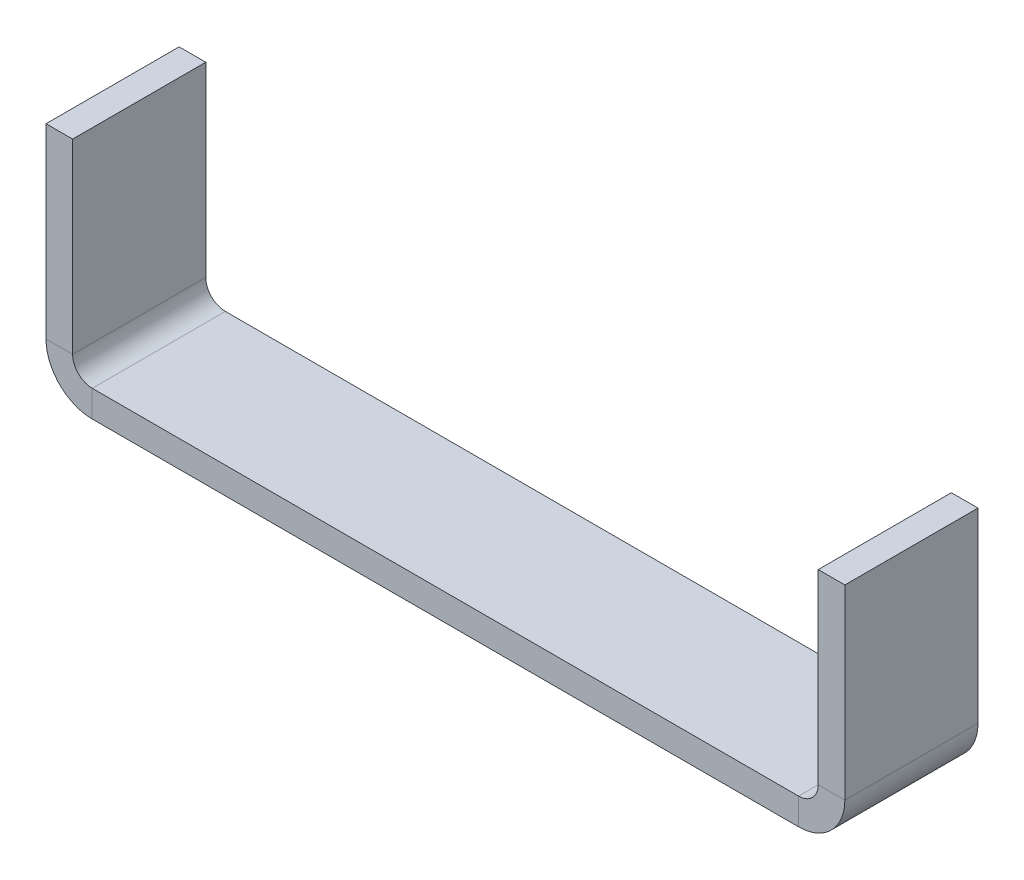
ISO-10303-21;
HEADER;
FILE_DESCRIPTION(('STEP AP214'),'2;1');
FILE_NAME('part.step','',(''),(''),'','','');
FILE_SCHEMA(('AUTOMOTIVE_DESIGN { 1 0 10303 214 1 1 1 1 }'));
ENDSEC;
DATA;
#1=APPLICATION_CONTEXT('core data for automotive mechanical design processes');
#2=APPLICATION_PROTOCOL_DEFINITION('international standard','automotive_design',2000,#1);
#3=PRODUCT_CONTEXT('',#1,'mechanical');
#4=PRODUCT('Part','Part','',(#3));
#5=PRODUCT_RELATED_PRODUCT_CATEGORY('part','',(#4));
#6=PRODUCT_DEFINITION_FORMATION('','',#4);
#7=PRODUCT_DEFINITION_CONTEXT('part definition',#1,'design');
#8=PRODUCT_DEFINITION('design','',#6,#7);
#9=PRODUCT_DEFINITION_SHAPE('','',#8);
#10=(LENGTH_UNIT() NAMED_UNIT(*) SI_UNIT(.MILLI.,.METRE.));
#11=(NAMED_UNIT(*) PLANE_ANGLE_UNIT() SI_UNIT($,.RADIAN.));
#12=(NAMED_UNIT(*) SI_UNIT($,.STERADIAN.) SOLID_ANGLE_UNIT());
#13=UNCERTAINTY_MEASURE_WITH_UNIT(LENGTH_MEASURE(1.E-05),#10,'distance_accuracy_value','');
#14=(GEOMETRIC_REPRESENTATION_CONTEXT(3) GLOBAL_UNCERTAINTY_ASSIGNED_CONTEXT((#13)) GLOBAL_UNIT_ASSIGNED_CONTEXT((#10,
#11,#12)) REPRESENTATION_CONTEXT('',''));
#15=CARTESIAN_POINT('',(0.,0.,0.));
#16=DIRECTION('',(0.,0.,1.));
#17=DIRECTION('',(1.,0.,0.));
#18=AXIS2_PLACEMENT_3D('',#15,#16,#17);
#19=CARTESIAN_POINT('',(0.,-1.,0.));
#20=DIRECTION('',(0.,1.,0.));
#21=DIRECTION('',(0.,0.,1.));
#22=AXIS2_PLACEMENT_3D('',#19,#20,#21);
#23=PLANE('',#22);
#24=DIRECTION('',(0.,0.,-1.));
#25=VECTOR('',#24,1.);
#26=CARTESIAN_POINT('',(13.2634,-1.,-2.5));
#27=LINE('',#26,#25);
#28=CARTESIAN_POINT('',(13.2634,-1.,-2.5));
#29=VERTEX_POINT('',#28);
#30=CARTESIAN_POINT('',(13.2634,-1.,2.5));
#31=VERTEX_POINT('',#30);
#32=EDGE_CURVE('E210',#29,#31,#27,.F.);
#33=ORIENTED_EDGE('',*,*,#32,.T.);
#34=DIRECTION('',(1.,0.,0.));
#35=VECTOR('',#34,1.);
#36=CARTESIAN_POINT('',(-15.,-1.,2.5));
#37=LINE('',#36,#35);
#38=CARTESIAN_POINT('',(-13.2634,-1.,2.5));
#39=VERTEX_POINT('',#38);
#40=EDGE_CURVE('E13',#39,#31,#37,.T.);
#41=ORIENTED_EDGE('',*,*,#40,.F.);
#42=DIRECTION('',(0.,0.,1.));
#43=VECTOR('',#42,1.);
#44=CARTESIAN_POINT('',(-13.2634,-1.,2.5));
#45=LINE('',#44,#43);
#46=CARTESIAN_POINT('',(-13.2634,-1.,-2.5));
#47=VERTEX_POINT('',#46);
#48=EDGE_CURVE('E263',#39,#47,#45,.F.);
#49=ORIENTED_EDGE('',*,*,#48,.T.);
#50=DIRECTION('',(-1.,0.,0.));
#51=VECTOR('',#50,1.);
#52=CARTESIAN_POINT('',(-15.,-1.,-2.5));
#53=LINE('',#52,#51);
#54=EDGE_CURVE('E86',#29,#47,#53,.T.);
#55=ORIENTED_EDGE('',*,*,#54,.F.);
#56=EDGE_LOOP('',(#33,#41,#49,#55));
#57=FACE_BOUND('',#56,.T.);
#58=ADVANCED_FACE('F77',(#57),#23,.F.);
#59=CARTESIAN_POINT('',(0.,0.,0.));
#60=DIRECTION('',(0.,1.,0.));
#61=DIRECTION('',(0.,0.,1.));
#62=AXIS2_PLACEMENT_3D('',#59,#60,#61);
#63=PLANE('',#62);
#64=DIRECTION('',(1.,0.,0.));
#65=VECTOR('',#64,1.);
#66=CARTESIAN_POINT('',(-15.,0.,2.5));
#67=LINE('',#66,#65);
#68=CARTESIAN_POINT('',(-13.2634,0.,2.5));
#69=VERTEX_POINT('',#68);
#70=CARTESIAN_POINT('',(13.2634,0.,2.5));
#71=VERTEX_POINT('',#70);
#72=EDGE_CURVE('E81',#69,#71,#67,.T.);
#73=ORIENTED_EDGE('',*,*,#72,.T.);
#74=DIRECTION('',(0.,0.,-1.));
#75=VECTOR('',#74,1.);
#76=CARTESIAN_POINT('',(13.2634,0.,-2.5));
#77=LINE('',#76,#75);
#78=CARTESIAN_POINT('',(13.2634,0.,-2.5));
#79=VERTEX_POINT('',#78);
#80=EDGE_CURVE('E222',#79,#71,#77,.F.);
#81=ORIENTED_EDGE('',*,*,#80,.F.);
#82=DIRECTION('',(-1.,0.,0.));
#83=VECTOR('',#82,1.);
#84=CARTESIAN_POINT('',(-15.,0.,-2.5));
#85=LINE('',#84,#83);
#86=CARTESIAN_POINT('',(-13.2634,0.,-2.5));
#87=VERTEX_POINT('',#86);
#88=EDGE_CURVE('E281',#79,#87,#85,.T.);
#89=ORIENTED_EDGE('',*,*,#88,.T.);
#90=DIRECTION('',(0.,0.,1.));
#91=VECTOR('',#90,1.);
#92=CARTESIAN_POINT('',(-13.2634,0.,2.5));
#93=LINE('',#92,#91);
#94=EDGE_CURVE('E94',#69,#87,#93,.F.);
#95=ORIENTED_EDGE('',*,*,#94,.F.);
#96=EDGE_LOOP('',(#73,#81,#89,#95));
#97=FACE_BOUND('',#96,.T.);
#98=ADVANCED_FACE('F285',(#97),#63,.T.);
#99=CARTESIAN_POINT('',(-15.,-1.,-2.5));
#100=DIRECTION('',(0.,0.,-1.));
#101=DIRECTION('',(-1.,0.,0.));
#102=AXIS2_PLACEMENT_3D('',#99,#100,#101);
#103=PLANE('',#102);
#104=ORIENTED_EDGE('',*,*,#88,.F.);
#105=DIRECTION('',(0.,-1.,0.));
#106=VECTOR('',#105,1.);
#107=CARTESIAN_POINT('',(13.2634,0.,-2.5));
#108=LINE('',#107,#106);
#109=EDGE_CURVE('E216',#79,#29,#108,.T.);
#110=ORIENTED_EDGE('',*,*,#109,.T.);
#111=ORIENTED_EDGE('',*,*,#54,.T.);
#112=DIRECTION('',(0.,-1.,0.));
#113=VECTOR('',#112,1.);
#114=CARTESIAN_POINT('',(-13.2634,0.,-2.5));
#115=LINE('',#114,#113);
#116=EDGE_CURVE('E278',#87,#47,#115,.T.);
#117=ORIENTED_EDGE('',*,*,#116,.F.);
#118=EDGE_LOOP('',(#104,#110,#111,#117));
#119=FACE_BOUND('',#118,.T.);
#120=ADVANCED_FACE('F79',(#119),#103,.T.);
#121=CARTESIAN_POINT('',(-15.,-1.,2.5));
#122=DIRECTION('',(0.,0.,1.));
#123=DIRECTION('',(1.,0.,0.));
#124=AXIS2_PLACEMENT_3D('',#121,#122,#123);
#125=PLANE('',#124);
#126=DIRECTION('',(0.,-1.,0.));
#127=VECTOR('',#126,1.);
#128=CARTESIAN_POINT('',(13.2634,0.,2.5));
#129=LINE('',#128,#127);
#130=EDGE_CURVE('E228',#71,#31,#129,.T.);
#131=ORIENTED_EDGE('',*,*,#130,.F.);
#132=ORIENTED_EDGE('',*,*,#72,.F.);
#133=DIRECTION('',(0.,-1.,0.));
#134=VECTOR('',#133,1.);
#135=CARTESIAN_POINT('',(-13.2634,0.,2.5));
#136=LINE('',#135,#134);
#137=EDGE_CURVE('E269',#69,#39,#136,.T.);
#138=ORIENTED_EDGE('',*,*,#137,.T.);
#139=ORIENTED_EDGE('',*,*,#40,.T.);
#140=EDGE_LOOP('',(#131,#132,#138,#139));
#141=FACE_BOUND('',#140,.T.);
#142=ADVANCED_FACE('F357',(#141),#125,.T.);
#143=CARTESIAN_POINT('',(-13.2634,0.7366,-2.5));
#144=DIRECTION('',(0.,0.,-1.));
#145=DIRECTION('',(-1.,0.,0.));
#146=AXIS2_PLACEMENT_3D('',#143,#144,#145);
#147=PLANE('',#146);
#148=DIRECTION('',(1.,0.,0.));
#149=VECTOR('',#148,1.);
#150=CARTESIAN_POINT('',(-15.,0.736599999999993,-2.5));
#151=LINE('',#150,#149);
#152=CARTESIAN_POINT('',(-14.,0.736599999999997,-2.5));
#153=VERTEX_POINT('',#152);
#154=CARTESIAN_POINT('',(-15.,0.736599999999993,-2.5));
#155=VERTEX_POINT('',#154);
#156=EDGE_CURVE('E231',#153,#155,#151,.F.);
#157=ORIENTED_EDGE('',*,*,#156,.F.);
#158=CARTESIAN_POINT('',(-13.2634,0.7366,-2.5));
#159=DIRECTION('',(0.,0.,1.));
#160=DIRECTION('',(1.,0.,0.));
#161=AXIS2_PLACEMENT_3D('',#158,#159,#160);
#162=CIRCLE('',#161,0.7366);
#163=EDGE_CURVE('E272',#87,#153,#162,.F.);
#164=ORIENTED_EDGE('',*,*,#163,.F.);
#165=ORIENTED_EDGE('',*,*,#116,.T.);
#166=CARTESIAN_POINT('',(-13.2634,0.7366,-2.5));
#167=DIRECTION('',(0.,0.,1.));
#168=DIRECTION('',(1.,0.,0.));
#169=AXIS2_PLACEMENT_3D('',#166,#167,#168);
#170=CIRCLE('',#169,1.7366);
#171=EDGE_CURVE('E265',#47,#155,#170,.F.);
#172=ORIENTED_EDGE('',*,*,#171,.T.);
#173=EDGE_LOOP('',(#157,#164,#165,#172));
#174=FACE_BOUND('',#173,.T.);
#175=ADVANCED_FACE('F316',(#174),#147,.T.);
#176=CARTESIAN_POINT('',(-13.2634,0.7366,2.5));
#177=DIRECTION('',(0.,0.,-1.));
#178=DIRECTION('',(-1.,0.,0.));
#179=AXIS2_PLACEMENT_3D('',#176,#177,#178);
#180=PLANE('',#179);
#181=CARTESIAN_POINT('',(-13.2634,0.7366,2.5));
#182=DIRECTION('',(0.,0.,1.));
#183=DIRECTION('',(1.,0.,0.));
#184=AXIS2_PLACEMENT_3D('',#181,#182,#183);
#185=CIRCLE('',#184,0.7366);
#186=CARTESIAN_POINT('',(-14.,0.736599999999997,2.5));
#187=VERTEX_POINT('',#186);
#188=EDGE_CURVE('E236',#187,#69,#185,.T.);
#189=ORIENTED_EDGE('',*,*,#188,.F.);
#190=DIRECTION('',(1.,0.,0.));
#191=VECTOR('',#190,1.);
#192=CARTESIAN_POINT('',(-14.,0.736599999999997,2.5));
#193=LINE('',#192,#191);
#194=CARTESIAN_POINT('',(-15.,0.736599999999993,2.5));
#195=VERTEX_POINT('',#194);
#196=EDGE_CURVE('E256',#187,#195,#193,.F.);
#197=ORIENTED_EDGE('',*,*,#196,.T.);
#198=CARTESIAN_POINT('',(-13.2634,0.7366,2.5));
#199=DIRECTION('',(0.,0.,1.));
#200=DIRECTION('',(1.,0.,0.));
#201=AXIS2_PLACEMENT_3D('',#198,#199,#200);
#202=CIRCLE('',#201,1.7366);
#203=EDGE_CURVE('E266',#195,#39,#202,.T.);
#204=ORIENTED_EDGE('',*,*,#203,.T.);
#205=ORIENTED_EDGE('',*,*,#137,.F.);
#206=EDGE_LOOP('',(#189,#197,#204,#205));
#207=FACE_BOUND('',#206,.T.);
#208=ADVANCED_FACE('F336',(#207),#180,.F.);
#209=CARTESIAN_POINT('',(-13.2634,0.7366,2.5));
#210=DIRECTION('',(0.,0.,1.));
#211=DIRECTION('',(-1.,0.,0.));
#212=AXIS2_PLACEMENT_3D('',#209,#210,#211);
#213=CYLINDRICAL_SURFACE('',#212,1.7366);
#214=ORIENTED_EDGE('',*,*,#48,.F.);
#215=ORIENTED_EDGE('',*,*,#203,.F.);
#216=DIRECTION('',(0.,0.,1.));
#217=VECTOR('',#216,1.);
#218=CARTESIAN_POINT('',(-15.,0.736599999999993,-2.5));
#219=LINE('',#218,#217);
#220=EDGE_CURVE('E254',#195,#155,#219,.F.);
#221=ORIENTED_EDGE('',*,*,#220,.T.);
#222=ORIENTED_EDGE('',*,*,#171,.F.);
#223=EDGE_LOOP('',(#214,#215,#221,#222));
#224=FACE_BOUND('',#223,.T.);
#225=ADVANCED_FACE('F365',(#224),#213,.T.);
#226=CARTESIAN_POINT('',(-13.2634,0.7366,2.5));
#227=DIRECTION('',(0.,0.,1.));
#228=DIRECTION('',(-1.,0.,0.));
#229=AXIS2_PLACEMENT_3D('',#226,#227,#228);
#230=CYLINDRICAL_SURFACE('',#229,0.7366);
#231=ORIENTED_EDGE('',*,*,#94,.T.);
#232=ORIENTED_EDGE('',*,*,#163,.T.);
#233=DIRECTION('',(0.,0.,1.));
#234=VECTOR('',#233,1.);
#235=CARTESIAN_POINT('',(-14.,0.736599999999997,-2.5));
#236=LINE('',#235,#234);
#237=EDGE_CURVE('E259',#153,#187,#236,.T.);
#238=ORIENTED_EDGE('',*,*,#237,.T.);
#239=ORIENTED_EDGE('',*,*,#188,.T.);
#240=EDGE_LOOP('',(#231,#232,#238,#239));
#241=FACE_BOUND('',#240,.T.);
#242=ADVANCED_FACE('F313',(#241),#230,.F.);
#243=CARTESIAN_POINT('',(-15.,0.,-2.5));
#244=DIRECTION('',(0.,0.,1.));
#245=DIRECTION('',(1.,0.,0.));
#246=AXIS2_PLACEMENT_3D('',#243,#244,#245);
#247=PLANE('',#246);
#248=ORIENTED_EDGE('',*,*,#156,.T.);
#249=DIRECTION('',(0.,-1.,0.));
#250=VECTOR('',#249,1.);
#251=CARTESIAN_POINT('',(-15.,0.,-2.5));
#252=LINE('',#251,#250);
#253=CARTESIAN_POINT('',(-15.,7.73659999999998,-2.5));
#254=VERTEX_POINT('',#253);
#255=EDGE_CURVE('E244',#254,#155,#252,.T.);
#256=ORIENTED_EDGE('',*,*,#255,.F.);
#257=DIRECTION('',(1.,0.,0.));
#258=VECTOR('',#257,1.);
#259=CARTESIAN_POINT('',(-15.,7.73659999999998,-2.5));
#260=LINE('',#259,#258);
#261=CARTESIAN_POINT('',(-14.,7.73659999999999,-2.5));
#262=VERTEX_POINT('',#261);
#263=EDGE_CURVE('E237',#254,#262,#260,.T.);
#264=ORIENTED_EDGE('',*,*,#263,.T.);
#265=DIRECTION('',(0.,1.,0.));
#266=VECTOR('',#265,1.);
#267=CARTESIAN_POINT('',(-14.,0.,-2.5));
#268=LINE('',#267,#266);
#269=EDGE_CURVE('E251',#262,#153,#268,.F.);
#270=ORIENTED_EDGE('',*,*,#269,.T.);
#271=EDGE_LOOP('',(#248,#256,#264,#270));
#272=FACE_BOUND('',#271,.T.);
#273=ADVANCED_FACE('F319',(#272),#247,.F.);
#274=CARTESIAN_POINT('',(-15.,7.73659999999998,2.5));
#275=DIRECTION('',(0.,0.,-1.));
#276=DIRECTION('',(-1.,0.,0.));
#277=AXIS2_PLACEMENT_3D('',#274,#275,#276);
#278=PLANE('',#277);
#279=ORIENTED_EDGE('',*,*,#196,.F.);
#280=DIRECTION('',(0.,-1.,0.));
#281=VECTOR('',#280,1.);
#282=CARTESIAN_POINT('',(-14.,7.73659999999999,2.5));
#283=LINE('',#282,#281);
#284=CARTESIAN_POINT('',(-14.,7.73659999999999,2.5));
#285=VERTEX_POINT('',#284);
#286=EDGE_CURVE('E249',#187,#285,#283,.F.);
#287=ORIENTED_EDGE('',*,*,#286,.T.);
#288=DIRECTION('',(1.,0.,0.));
#289=VECTOR('',#288,1.);
#290=CARTESIAN_POINT('',(-15.,7.73659999999998,2.5));
#291=LINE('',#290,#289);
#292=CARTESIAN_POINT('',(-15.,7.73659999999998,2.5));
#293=VERTEX_POINT('',#292);
#294=EDGE_CURVE('E233',#293,#285,#291,.T.);
#295=ORIENTED_EDGE('',*,*,#294,.F.);
#296=DIRECTION('',(0.,1.,0.));
#297=VECTOR('',#296,1.);
#298=CARTESIAN_POINT('',(-15.,0.,2.5));
#299=LINE('',#298,#297);
#300=EDGE_CURVE('E242',#195,#293,#299,.T.);
#301=ORIENTED_EDGE('',*,*,#300,.F.);
#302=EDGE_LOOP('',(#279,#287,#295,#301));
#303=FACE_BOUND('',#302,.T.);
#304=ADVANCED_FACE('F338',(#303),#278,.F.);
#305=CARTESIAN_POINT('',(-15.,0.,0.));
#306=DIRECTION('',(1.,0.,0.));
#307=DIRECTION('',(0.,1.,0.));
#308=AXIS2_PLACEMENT_3D('',#305,#306,#307);
#309=PLANE('',#308);
#310=ORIENTED_EDGE('',*,*,#220,.F.);
#311=ORIENTED_EDGE('',*,*,#300,.T.);
#312=DIRECTION('',(0.,0.,-1.));
#313=VECTOR('',#312,1.);
#314=CARTESIAN_POINT('',(-15.,7.73659999999998,0.));
#315=LINE('',#314,#313);
#316=EDGE_CURVE('E240',#293,#254,#315,.T.);
#317=ORIENTED_EDGE('',*,*,#316,.T.);
#318=ORIENTED_EDGE('',*,*,#255,.T.);
#319=EDGE_LOOP('',(#310,#311,#317,#318));
#320=FACE_BOUND('',#319,.T.);
#321=ADVANCED_FACE('F323',(#320),#309,.F.);
#322=CARTESIAN_POINT('',(-14.,0.,0.));
#323=DIRECTION('',(1.,0.,0.));
#324=DIRECTION('',(0.,1.,0.));
#325=AXIS2_PLACEMENT_3D('',#322,#323,#324);
#326=PLANE('',#325);
#327=ORIENTED_EDGE('',*,*,#286,.F.);
#328=ORIENTED_EDGE('',*,*,#237,.F.);
#329=ORIENTED_EDGE('',*,*,#269,.F.);
#330=DIRECTION('',(0.,0.,1.));
#331=VECTOR('',#330,1.);
#332=CARTESIAN_POINT('',(-14.,7.73659999999999,-2.5));
#333=LINE('',#332,#331);
#334=EDGE_CURVE('E247',#285,#262,#333,.F.);
#335=ORIENTED_EDGE('',*,*,#334,.F.);
#336=EDGE_LOOP('',(#327,#328,#329,#335));
#337=FACE_BOUND('',#336,.T.);
#338=ADVANCED_FACE('F333',(#337),#326,.T.);
#339=CARTESIAN_POINT('',(-15.,7.73659999999998,-2.5));
#340=DIRECTION('',(0.,-1.,0.));
#341=DIRECTION('',(1.,0.,0.));
#342=AXIS2_PLACEMENT_3D('',#339,#340,#341);
#343=PLANE('',#342);
#344=ORIENTED_EDGE('',*,*,#334,.T.);
#345=ORIENTED_EDGE('',*,*,#263,.F.);
#346=ORIENTED_EDGE('',*,*,#316,.F.);
#347=ORIENTED_EDGE('',*,*,#294,.T.);
#348=EDGE_LOOP('',(#344,#345,#346,#347));
#349=FACE_BOUND('',#348,.T.);
#350=ADVANCED_FACE('F329',(#349),#343,.F.);
#351=CARTESIAN_POINT('',(13.2634,0.7366,2.5));
#352=DIRECTION('',(0.,0.,1.));
#353=DIRECTION('',(1.,0.,0.));
#354=AXIS2_PLACEMENT_3D('',#351,#352,#353);
#355=PLANE('',#354);
#356=DIRECTION('',(-1.,0.,0.));
#357=VECTOR('',#356,1.);
#358=CARTESIAN_POINT('',(15.,0.736599999999993,2.5));
#359=LINE('',#358,#357);
#360=CARTESIAN_POINT('',(14.,0.736599999999997,2.5));
#361=VERTEX_POINT('',#360);
#362=CARTESIAN_POINT('',(15.,0.736599999999993,2.5));
#363=VERTEX_POINT('',#362);
#364=EDGE_CURVE('E193',#361,#363,#359,.F.);
#365=ORIENTED_EDGE('',*,*,#364,.F.);
#366=CARTESIAN_POINT('',(13.2634,0.7366,2.5));
#367=DIRECTION('',(0.,0.,-1.));
#368=DIRECTION('',(-1.,0.,0.));
#369=AXIS2_PLACEMENT_3D('',#366,#367,#368);
#370=CIRCLE('',#369,0.7366);
#371=EDGE_CURVE('E219',#71,#361,#370,.F.);
#372=ORIENTED_EDGE('',*,*,#371,.F.);
#373=ORIENTED_EDGE('',*,*,#130,.T.);
#374=CARTESIAN_POINT('',(13.2634,0.7366,2.5));
#375=DIRECTION('',(0.,0.,-1.));
#376=DIRECTION('',(-1.,0.,0.));
#377=AXIS2_PLACEMENT_3D('',#374,#375,#376);
#378=CIRCLE('',#377,1.7366);
#379=EDGE_CURVE('E212',#31,#363,#378,.F.);
#380=ORIENTED_EDGE('',*,*,#379,.T.);
#381=EDGE_LOOP('',(#365,#372,#373,#380));
#382=FACE_BOUND('',#381,.T.);
#383=ADVANCED_FACE('F294',(#382),#355,.T.);
#384=CARTESIAN_POINT('',(13.2634,0.7366,-2.5));
#385=DIRECTION('',(0.,0.,1.));
#386=DIRECTION('',(1.,0.,0.));
#387=AXIS2_PLACEMENT_3D('',#384,#385,#386);
#388=PLANE('',#387);
#389=CARTESIAN_POINT('',(13.2634,0.7366,-2.5));
#390=DIRECTION('',(0.,0.,-1.));
#391=DIRECTION('',(-1.,0.,0.));
#392=AXIS2_PLACEMENT_3D('',#389,#390,#391);
#393=CIRCLE('',#392,0.7366);
#394=CARTESIAN_POINT('',(14.,0.736599999999997,-2.5));
#395=VERTEX_POINT('',#394);
#396=EDGE_CURVE('E225',#395,#79,#393,.T.);
#397=ORIENTED_EDGE('',*,*,#396,.F.);
#398=DIRECTION('',(-1.,0.,0.));
#399=VECTOR('',#398,1.);
#400=CARTESIAN_POINT('',(14.,0.736599999999997,-2.5));
#401=LINE('',#400,#399);
#402=CARTESIAN_POINT('',(15.,0.736599999999993,-2.5));
#403=VERTEX_POINT('',#402);
#404=EDGE_CURVE('E204',#395,#403,#401,.F.);
#405=ORIENTED_EDGE('',*,*,#404,.T.);
#406=CARTESIAN_POINT('',(13.2634,0.7366,-2.5));
#407=DIRECTION('',(0.,0.,-1.));
#408=DIRECTION('',(-1.,0.,0.));
#409=AXIS2_PLACEMENT_3D('',#406,#407,#408);
#410=CIRCLE('',#409,1.7366);
#411=EDGE_CURVE('E213',#403,#29,#410,.T.);
#412=ORIENTED_EDGE('',*,*,#411,.T.);
#413=ORIENTED_EDGE('',*,*,#109,.F.);
#414=EDGE_LOOP('',(#397,#405,#412,#413));
#415=FACE_BOUND('',#414,.T.);
#416=ADVANCED_FACE('F308',(#415),#388,.F.);
#417=CARTESIAN_POINT('',(13.2634,0.7366,-2.5));
#418=DIRECTION('',(0.,0.,-1.));
#419=DIRECTION('',(1.,0.,0.));
#420=AXIS2_PLACEMENT_3D('',#417,#418,#419);
#421=CYLINDRICAL_SURFACE('',#420,1.7366);
#422=ORIENTED_EDGE('',*,*,#32,.F.);
#423=ORIENTED_EDGE('',*,*,#411,.F.);
#424=DIRECTION('',(0.,0.,-1.));
#425=VECTOR('',#424,1.);
#426=CARTESIAN_POINT('',(15.,0.736599999999993,2.5));
#427=LINE('',#426,#425);
#428=EDGE_CURVE('E202',#403,#363,#427,.F.);
#429=ORIENTED_EDGE('',*,*,#428,.T.);
#430=ORIENTED_EDGE('',*,*,#379,.F.);
#431=EDGE_LOOP('',(#422,#423,#429,#430));
#432=FACE_BOUND('',#431,.T.);
#433=ADVANCED_FACE('F298',(#432),#421,.T.);
#434=CARTESIAN_POINT('',(13.2634,0.7366,-2.5));
#435=DIRECTION('',(0.,0.,-1.));
#436=DIRECTION('',(1.,0.,0.));
#437=AXIS2_PLACEMENT_3D('',#434,#435,#436);
#438=CYLINDRICAL_SURFACE('',#437,0.7366);
#439=ORIENTED_EDGE('',*,*,#80,.T.);
#440=ORIENTED_EDGE('',*,*,#371,.T.);
#441=DIRECTION('',(0.,0.,-1.));
#442=VECTOR('',#441,1.);
#443=CARTESIAN_POINT('',(14.,0.736599999999997,2.5));
#444=LINE('',#443,#442);
#445=EDGE_CURVE('E207',#361,#395,#444,.T.);
#446=ORIENTED_EDGE('',*,*,#445,.T.);
#447=ORIENTED_EDGE('',*,*,#396,.T.);
#448=EDGE_LOOP('',(#439,#440,#446,#447));
#449=FACE_BOUND('',#448,.T.);
#450=ADVANCED_FACE('F290',(#449),#438,.F.);
#451=CARTESIAN_POINT('',(15.,0.,2.5));
#452=DIRECTION('',(0.,0.,-1.));
#453=DIRECTION('',(-1.,0.,0.));
#454=AXIS2_PLACEMENT_3D('',#451,#452,#453);
#455=PLANE('',#454);
#456=ORIENTED_EDGE('',*,*,#364,.T.);
#457=DIRECTION('',(0.,-1.,0.));
#458=VECTOR('',#457,1.);
#459=CARTESIAN_POINT('',(15.,0.,2.5));
#460=LINE('',#459,#458);
#461=CARTESIAN_POINT('',(15.,7.73659999999999,2.5));
#462=VERTEX_POINT('',#461);
#463=EDGE_CURVE('E174',#462,#363,#460,.T.);
#464=ORIENTED_EDGE('',*,*,#463,.F.);
#465=DIRECTION('',(-1.,0.,0.));
#466=VECTOR('',#465,1.);
#467=CARTESIAN_POINT('',(15.,7.73659999999999,2.5));
#468=LINE('',#467,#466);
#469=CARTESIAN_POINT('',(14.,7.7366,2.5));
#470=VERTEX_POINT('',#469);
#471=EDGE_CURVE('E180',#462,#470,#468,.T.);
#472=ORIENTED_EDGE('',*,*,#471,.T.);
#473=DIRECTION('',(0.,1.,0.));
#474=VECTOR('',#473,1.);
#475=CARTESIAN_POINT('',(14.,0.,2.5));
#476=LINE('',#475,#474);
#477=EDGE_CURVE('E200',#470,#361,#476,.F.);
#478=ORIENTED_EDGE('',*,*,#477,.T.);
#479=EDGE_LOOP('',(#456,#464,#472,#478));
#480=FACE_BOUND('',#479,.T.);
#481=ADVANCED_FACE('F192',(#480),#455,.F.);
#482=CARTESIAN_POINT('',(15.,7.73659999999999,-2.5));
#483=DIRECTION('',(0.,0.,1.));
#484=DIRECTION('',(1.,0.,0.));
#485=AXIS2_PLACEMENT_3D('',#482,#483,#484);
#486=PLANE('',#485);
#487=ORIENTED_EDGE('',*,*,#404,.F.);
#488=DIRECTION('',(0.,-1.,0.));
#489=VECTOR('',#488,1.);
#490=CARTESIAN_POINT('',(14.,7.7366,-2.5));
#491=LINE('',#490,#489);
#492=CARTESIAN_POINT('',(14.,7.7366,-2.5));
#493=VERTEX_POINT('',#492);
#494=EDGE_CURVE('E196',#395,#493,#491,.F.);
#495=ORIENTED_EDGE('',*,*,#494,.T.);
#496=DIRECTION('',(-1.,0.,0.));
#497=VECTOR('',#496,1.);
#498=CARTESIAN_POINT('',(15.,7.73659999999999,-2.5));
#499=LINE('',#498,#497);
#500=CARTESIAN_POINT('',(15.,7.73659999999999,-2.5));
#501=VERTEX_POINT('',#500);
#502=EDGE_CURVE('E189',#501,#493,#499,.T.);
#503=ORIENTED_EDGE('',*,*,#502,.F.);
#504=DIRECTION('',(0.,1.,0.));
#505=VECTOR('',#504,1.);
#506=CARTESIAN_POINT('',(15.,0.,-2.5));
#507=LINE('',#506,#505);
#508=EDGE_CURVE('E176',#403,#501,#507,.T.);
#509=ORIENTED_EDGE('',*,*,#508,.F.);
#510=EDGE_LOOP('',(#487,#495,#503,#509));
#511=FACE_BOUND('',#510,.T.);
#512=ADVANCED_FACE('F301',(#511),#486,.F.);
#513=CARTESIAN_POINT('',(15.,0.,0.));
#514=DIRECTION('',(-1.,0.,0.));
#515=DIRECTION('',(0.,-1.,0.));
#516=AXIS2_PLACEMENT_3D('',#513,#514,#515);
#517=PLANE('',#516);
#518=ORIENTED_EDGE('',*,*,#428,.F.);
#519=ORIENTED_EDGE('',*,*,#508,.T.);
#520=DIRECTION('',(0.,0.,1.));
#521=VECTOR('',#520,1.);
#522=CARTESIAN_POINT('',(15.,7.73659999999999,0.));
#523=LINE('',#522,#521);
#524=EDGE_CURVE('E169',#501,#462,#523,.T.);
#525=ORIENTED_EDGE('',*,*,#524,.T.);
#526=ORIENTED_EDGE('',*,*,#463,.T.);
#527=EDGE_LOOP('',(#518,#519,#525,#526));
#528=FACE_BOUND('',#527,.T.);
#529=ADVANCED_FACE('F172',(#528),#517,.F.);
#530=CARTESIAN_POINT('',(14.,0.,0.));
#531=DIRECTION('',(-1.,0.,0.));
#532=DIRECTION('',(0.,-1.,0.));
#533=AXIS2_PLACEMENT_3D('',#530,#531,#532);
#534=PLANE('',#533);
#535=ORIENTED_EDGE('',*,*,#494,.F.);
#536=ORIENTED_EDGE('',*,*,#445,.F.);
#537=ORIENTED_EDGE('',*,*,#477,.F.);
#538=DIRECTION('',(0.,0.,-1.));
#539=VECTOR('',#538,1.);
#540=CARTESIAN_POINT('',(14.,7.7366,2.5));
#541=LINE('',#540,#539);
#542=EDGE_CURVE('E185',#493,#470,#541,.F.);
#543=ORIENTED_EDGE('',*,*,#542,.F.);
#544=EDGE_LOOP('',(#535,#536,#537,#543));
#545=FACE_BOUND('',#544,.T.);
#546=ADVANCED_FACE('F305',(#545),#534,.T.);
#547=CARTESIAN_POINT('',(15.,7.73659999999999,2.5));
#548=DIRECTION('',(0.,-1.,0.));
#549=DIRECTION('',(1.,0.,0.));
#550=AXIS2_PLACEMENT_3D('',#547,#548,#549);
#551=PLANE('',#550);
#552=ORIENTED_EDGE('',*,*,#542,.T.);
#553=ORIENTED_EDGE('',*,*,#471,.F.);
#554=ORIENTED_EDGE('',*,*,#524,.F.);
#555=ORIENTED_EDGE('',*,*,#502,.T.);
#556=EDGE_LOOP('',(#552,#553,#554,#555));
#557=FACE_BOUND('',#556,.T.);
#558=ADVANCED_FACE('F183',(#557),#551,.F.);
#559=CLOSED_SHELL('',(#58,#98,#120,#142,#175,#208,#225,#242,#273,#304,#321,#338,#350,#383,#416,
#433,#450,#481,#512,#529,#546,#558));
#560=MANIFOLD_SOLID_BREP('B2',#559);
#561=ADVANCED_BREP_SHAPE_REPRESENTATION('',(#18,#560),#14);
#562=SHAPE_DEFINITION_REPRESENTATION(#9,#561);
ENDSEC;
END-ISO-10303-21;
